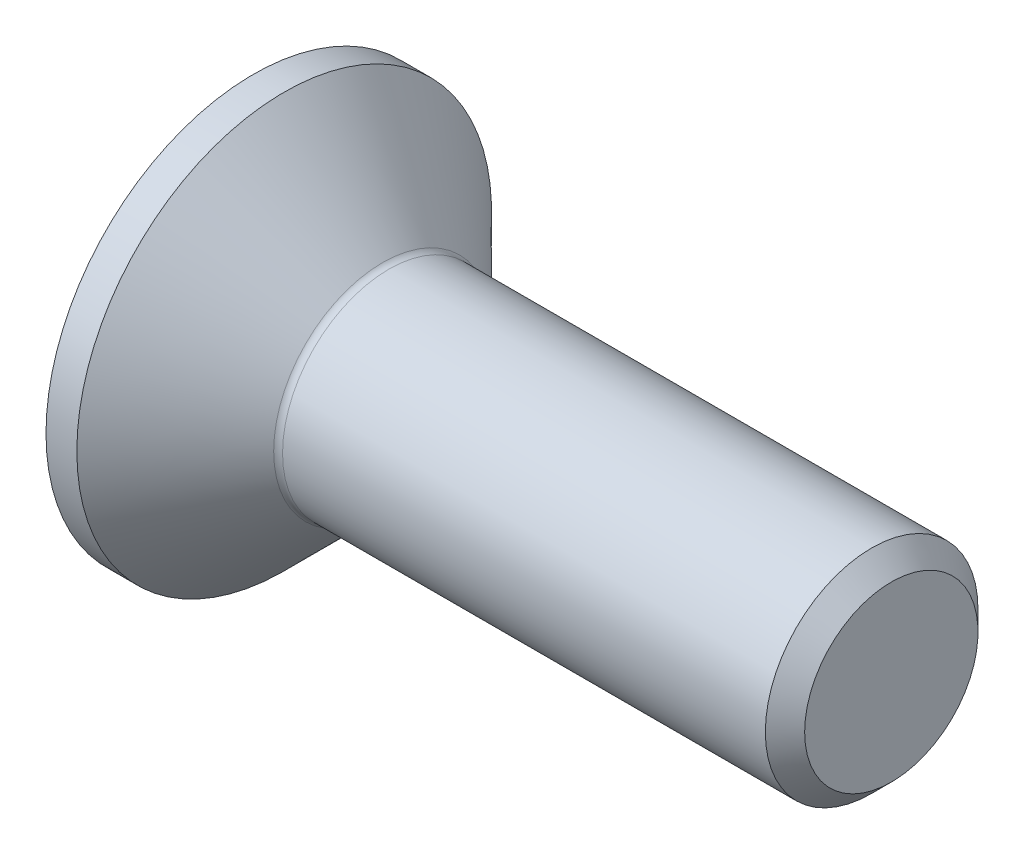
ISO-10303-21;
HEADER;
FILE_DESCRIPTION(('STEP AP214'),'2;1');
FILE_NAME('part.step','',(''),(''),'','','');
FILE_SCHEMA(('AUTOMOTIVE_DESIGN { 1 0 10303 214 1 1 1 1 }'));
ENDSEC;
DATA;
#1=APPLICATION_CONTEXT('core data for automotive mechanical design processes');
#2=APPLICATION_PROTOCOL_DEFINITION('international standard','automotive_design',2000,#1);
#3=PRODUCT_CONTEXT('',#1,'mechanical');
#4=PRODUCT('Part','Part','',(#3));
#5=PRODUCT_RELATED_PRODUCT_CATEGORY('part','',(#4));
#6=PRODUCT_DEFINITION_FORMATION('','',#4);
#7=PRODUCT_DEFINITION_CONTEXT('part definition',#1,'design');
#8=PRODUCT_DEFINITION('design','',#6,#7);
#9=PRODUCT_DEFINITION_SHAPE('','',#8);
#10=(LENGTH_UNIT() NAMED_UNIT(*) SI_UNIT(.MILLI.,.METRE.));
#11=(NAMED_UNIT(*) PLANE_ANGLE_UNIT() SI_UNIT($,.RADIAN.));
#12=(NAMED_UNIT(*) SI_UNIT($,.STERADIAN.) SOLID_ANGLE_UNIT());
#13=UNCERTAINTY_MEASURE_WITH_UNIT(LENGTH_MEASURE(1.E-05),#10,'distance_accuracy_value','');
#14=(GEOMETRIC_REPRESENTATION_CONTEXT(3) GLOBAL_UNCERTAINTY_ASSIGNED_CONTEXT((#13)) GLOBAL_UNIT_ASSIGNED_CONTEXT((#10,
#11,#12)) REPRESENTATION_CONTEXT('',''));
#15=CARTESIAN_POINT('',(0.,0.,0.));
#16=DIRECTION('',(0.,0.,1.));
#17=DIRECTION('',(1.,0.,0.));
#18=AXIS2_PLACEMENT_3D('',#15,#16,#17);
#19=CARTESIAN_POINT('',(0.,0.,0.));
#20=DIRECTION('',(-1.,0.,0.));
#21=DIRECTION('',(0.,0.,1.));
#22=AXIS2_PLACEMENT_3D('',#19,#20,#21);
#23=PLANE('',#22);
#24=CARTESIAN_POINT('',(0.,0.,0.));
#25=DIRECTION('',(-1.,0.,0.));
#26=DIRECTION('',(0.,0.,1.));
#27=AXIS2_PLACEMENT_3D('',#24,#25,#26);
#28=CIRCLE('',#27,5.85);
#29=CARTESIAN_POINT('',(0.,0.,5.85));
#30=VERTEX_POINT('',#29);
#31=EDGE_CURVE('E158',#30,#30,#28,.T.);
#32=ORIENTED_EDGE('',*,*,#31,.T.);
#33=EDGE_LOOP('',(#32));
#34=FACE_BOUND('',#33,.T.);
#35=DIRECTION('',(0.,-0.500000000000001,-0.866025403784438));
#36=VECTOR('',#35,1.);
#37=CARTESIAN_POINT('',(0.,-1.15470053837925,2.));
#38=LINE('',#37,#36);
#39=CARTESIAN_POINT('',(0.,-1.15470053837925,2.));
#40=VERTEX_POINT('',#39);
#41=CARTESIAN_POINT('',(0.,-2.3094010767585,0.));
#42=VERTEX_POINT('',#41);
#43=EDGE_CURVE('E120',#40,#42,#38,.T.);
#44=ORIENTED_EDGE('',*,*,#43,.T.);
#45=DIRECTION('',(0.,0.500000000000001,-0.866025403784438));
#46=VECTOR('',#45,1.);
#47=CARTESIAN_POINT('',(0.,-2.3094010767585,0.));
#48=LINE('',#47,#46);
#49=CARTESIAN_POINT('',(0.,-1.15470053837925,-2.));
#50=VERTEX_POINT('',#49);
#51=EDGE_CURVE('E50',#42,#50,#48,.T.);
#52=ORIENTED_EDGE('',*,*,#51,.T.);
#53=DIRECTION('',(0.,1.,0.));
#54=VECTOR('',#53,1.);
#55=CARTESIAN_POINT('',(0.,-1.15470053837925,-2.));
#56=LINE('',#55,#54);
#57=CARTESIAN_POINT('',(0.,1.15470053837925,-2.));
#58=VERTEX_POINT('',#57);
#59=EDGE_CURVE('E135',#50,#58,#56,.T.);
#60=ORIENTED_EDGE('',*,*,#59,.T.);
#61=DIRECTION('',(0.,0.5,0.866025403784438));
#62=VECTOR('',#61,1.);
#63=CARTESIAN_POINT('',(0.,1.15470053837925,-2.));
#64=LINE('',#63,#62);
#65=CARTESIAN_POINT('',(0.,2.3094010767585,0.));
#66=VERTEX_POINT('',#65);
#67=EDGE_CURVE('E271',#58,#66,#64,.T.);
#68=ORIENTED_EDGE('',*,*,#67,.T.);
#69=DIRECTION('',(0.,-0.5,0.866025403784439));
#70=VECTOR('',#69,1.);
#71=CARTESIAN_POINT('',(0.,2.3094010767585,0.));
#72=LINE('',#71,#70);
#73=CARTESIAN_POINT('',(0.,1.15470053837925,2.));
#74=VERTEX_POINT('',#73);
#75=EDGE_CURVE('E274',#66,#74,#72,.T.);
#76=ORIENTED_EDGE('',*,*,#75,.T.);
#77=DIRECTION('',(0.,-1.,0.));
#78=VECTOR('',#77,1.);
#79=CARTESIAN_POINT('',(0.,1.15470053837925,2.));
#80=LINE('',#79,#78);
#81=EDGE_CURVE('E277',#74,#40,#80,.T.);
#82=ORIENTED_EDGE('',*,*,#81,.T.);
#83=EDGE_LOOP('',(#44,#52,#60,#68,#76,#82));
#84=FACE_BOUND('',#83,.T.);
#85=ADVANCED_FACE('F35',(#34,#84),#23,.T.);
#86=CARTESIAN_POINT('',(0.,0.,0.));
#87=DIRECTION('',(-1.,0.,0.));
#88=DIRECTION('',(0.,0.,1.));
#89=AXIS2_PLACEMENT_3D('',#86,#87,#88);
#90=CYLINDRICAL_SURFACE('',#89,5.85);
#91=CARTESIAN_POINT('',(0.870000000000014,0.,0.));
#92=DIRECTION('',(-1.,0.,0.));
#93=DIRECTION('',(0.,0.,1.));
#94=AXIS2_PLACEMENT_3D('',#91,#92,#93);
#95=CIRCLE('',#94,5.85);
#96=CARTESIAN_POINT('',(0.870000000000014,0.,5.85));
#97=VERTEX_POINT('',#96);
#98=EDGE_CURVE('E155',#97,#97,#95,.T.);
#99=ORIENTED_EDGE('',*,*,#98,.T.);
#100=EDGE_LOOP('',(#99));
#101=FACE_BOUND('',#100,.T.);
#102=ORIENTED_EDGE('',*,*,#31,.F.);
#103=EDGE_LOOP('',(#102));
#104=FACE_BOUND('',#103,.T.);
#105=ADVANCED_FACE('F179',(#101,#104),#90,.T.);
#106=CARTESIAN_POINT('',(0.870000000000014,0.,0.));
#107=DIRECTION('',(-1.,0.,0.));
#108=DIRECTION('',(0.,0.,1.));
#109=AXIS2_PLACEMENT_3D('',#106,#107,#108);
#110=CONICAL_SURFACE('',#109,5.85,0.78539816339745);
#111=CARTESIAN_POINT('',(3.64677669529668,0.,0.));
#112=DIRECTION('',(-1.,0.,0.));
#113=DIRECTION('',(0.,0.,1.));
#114=AXIS2_PLACEMENT_3D('',#111,#112,#113);
#115=CIRCLE('',#114,3.07322330470332);
#116=CARTESIAN_POINT('',(3.64677669529668,0.,3.07322330470332));
#117=VERTEX_POINT('',#116);
#118=EDGE_CURVE('E43',#117,#117,#115,.T.);
#119=ORIENTED_EDGE('',*,*,#118,.T.);
#120=EDGE_LOOP('',(#119));
#121=FACE_BOUND('',#120,.T.);
#122=ORIENTED_EDGE('',*,*,#98,.F.);
#123=EDGE_LOOP('',(#122));
#124=FACE_BOUND('',#123,.T.);
#125=ADVANCED_FACE('F163',(#121,#124),#110,.T.);
#126=CARTESIAN_POINT('',(0.,0.,0.));
#127=DIRECTION('',(-1.,0.,0.));
#128=DIRECTION('',(0.,0.,1.));
#129=AXIS2_PLACEMENT_3D('',#126,#127,#128);
#130=CYLINDRICAL_SURFACE('',#129,2.99999999999996);
#131=CARTESIAN_POINT('',(3.82355339059332,0.,0.));
#132=DIRECTION('',(-1.,0.,0.));
#133=DIRECTION('',(0.,0.,1.));
#134=AXIS2_PLACEMENT_3D('',#131,#132,#133);
#135=CIRCLE('',#134,2.99999999999996);
#136=CARTESIAN_POINT('',(3.82355339059332,0.,2.99999999999996));
#137=VERTEX_POINT('',#136);
#138=EDGE_CURVE('E11',#137,#137,#135,.F.);
#139=ORIENTED_EDGE('',*,*,#138,.T.);
#140=EDGE_LOOP('',(#139));
#141=FACE_BOUND('',#140,.T.);
#142=CARTESIAN_POINT('',(17.4454999999999,0.,0.));
#143=DIRECTION('',(-1.,0.,0.));
#144=DIRECTION('',(0.,0.,1.));
#145=AXIS2_PLACEMENT_3D('',#142,#143,#144);
#146=CIRCLE('',#145,2.99999999999992);
#147=CARTESIAN_POINT('',(17.4454999999999,0.,2.99999999999992));
#148=VERTEX_POINT('',#147);
#149=EDGE_CURVE('E152',#148,#148,#146,.T.);
#150=ORIENTED_EDGE('',*,*,#149,.T.);
#151=EDGE_LOOP('',(#150));
#152=FACE_BOUND('',#151,.T.);
#153=ADVANCED_FACE('F190',(#141,#152),#130,.T.);
#154=CARTESIAN_POINT('',(18.,0.,0.));
#155=DIRECTION('',(-1.,0.,0.));
#156=DIRECTION('',(0.,0.,1.));
#157=AXIS2_PLACEMENT_3D('',#154,#155,#156);
#158=CONICAL_SURFACE('',#157,2.4455,0.785398163397309);
#159=ORIENTED_EDGE('',*,*,#149,.F.);
#160=EDGE_LOOP('',(#159));
#161=FACE_BOUND('',#160,.T.);
#162=CARTESIAN_POINT('',(18.,0.,0.));
#163=DIRECTION('',(-1.,0.,0.));
#164=DIRECTION('',(0.,0.,1.));
#165=AXIS2_PLACEMENT_3D('',#162,#163,#164);
#166=CIRCLE('',#165,2.4455);
#167=CARTESIAN_POINT('',(18.,0.,2.4455));
#168=VERTEX_POINT('',#167);
#169=EDGE_CURVE('E148',#168,#168,#166,.T.);
#170=ORIENTED_EDGE('',*,*,#169,.T.);
#171=EDGE_LOOP('',(#170));
#172=FACE_BOUND('',#171,.T.);
#173=ADVANCED_FACE('F174',(#161,#172),#158,.T.);
#174=CARTESIAN_POINT('',(18.,2.4455,0.));
#175=DIRECTION('',(1.,0.,0.));
#176=DIRECTION('',(0.,0.,-1.));
#177=AXIS2_PLACEMENT_3D('',#174,#175,#176);
#178=PLANE('',#177);
#179=ORIENTED_EDGE('',*,*,#169,.F.);
#180=EDGE_LOOP('',(#179));
#181=FACE_BOUND('',#180,.T.);
#182=ADVANCED_FACE('F167',(#181),#178,.T.);
#183=CARTESIAN_POINT('',(3.82355339059332,0.,0.));
#184=DIRECTION('',(-1.,0.,0.));
#185=DIRECTION('',(0.,0.,1.));
#186=AXIS2_PLACEMENT_3D('',#183,#184,#185);
#187=TOROIDAL_SURFACE('',#186,3.24999999999996,0.25);
#188=ORIENTED_EDGE('',*,*,#138,.F.);
#189=EDGE_LOOP('',(#188));
#190=FACE_BOUND('',#189,.T.);
#191=ORIENTED_EDGE('',*,*,#118,.F.);
#192=EDGE_LOOP('',(#191));
#193=FACE_BOUND('',#192,.T.);
#194=ADVANCED_FACE('F37',(#190,#193),#187,.F.);
#195=CARTESIAN_POINT('',(2.2,-2.3094010767585,0.));
#196=DIRECTION('',(0.,0.866025403784438,0.500000000000001));
#197=DIRECTION('',(0.,-0.500000000000001,0.866025403784438));
#198=AXIS2_PLACEMENT_3D('',#195,#196,#197);
#199=PLANE('',#198);
#200=ORIENTED_EDGE('',*,*,#51,.F.);
#201=DIRECTION('',(-1.,0.,0.));
#202=VECTOR('',#201,1.);
#203=CARTESIAN_POINT('',(2.2,-2.3094010767585,0.));
#204=LINE('',#203,#202);
#205=CARTESIAN_POINT('',(2.2,-2.3094010767585,0.));
#206=VERTEX_POINT('',#205);
#207=EDGE_CURVE('E268',#206,#42,#204,.T.);
#208=ORIENTED_EDGE('',*,*,#207,.F.);
#209=DIRECTION('',(0.,0.500000000000001,-0.866025403784438));
#210=VECTOR('',#209,1.);
#211=CARTESIAN_POINT('',(2.2,-2.3094010767585,0.));
#212=LINE('',#211,#210);
#213=CARTESIAN_POINT('',(2.2,-1.73205080756888,-1.));
#214=VERTEX_POINT('',#213);
#215=EDGE_CURVE('E117',#206,#214,#212,.T.);
#216=ORIENTED_EDGE('',*,*,#215,.T.);
#217=CARTESIAN_POINT('',(2.2,-1.15470053837925,-2.));
#218=VERTEX_POINT('',#217);
#219=EDGE_CURVE('E111',#214,#218,#212,.T.);
#220=ORIENTED_EDGE('',*,*,#219,.T.);
#221=DIRECTION('',(-1.,0.,0.));
#222=VECTOR('',#221,1.);
#223=CARTESIAN_POINT('',(2.2,-1.15470053837925,-2.));
#224=LINE('',#223,#222);
#225=EDGE_CURVE('E115',#218,#50,#224,.T.);
#226=ORIENTED_EDGE('',*,*,#225,.T.);
#227=EDGE_LOOP('',(#200,#208,#216,#220,#226));
#228=FACE_BOUND('',#227,.T.);
#229=ADVANCED_FACE('F113',(#228),#199,.T.);
#230=CARTESIAN_POINT('',(2.2,-1.15470053837925,-2.));
#231=DIRECTION('',(0.,0.,1.));
#232=DIRECTION('',(1.,0.,0.));
#233=AXIS2_PLACEMENT_3D('',#230,#231,#232);
#234=PLANE('',#233);
#235=ORIENTED_EDGE('',*,*,#59,.F.);
#236=ORIENTED_EDGE('',*,*,#225,.F.);
#237=DIRECTION('',(0.,1.,0.));
#238=VECTOR('',#237,1.);
#239=CARTESIAN_POINT('',(2.2,-1.15470053837925,-2.));
#240=LINE('',#239,#238);
#241=CARTESIAN_POINT('',(2.2,0.,-2.));
#242=VERTEX_POINT('',#241);
#243=EDGE_CURVE('E123',#218,#242,#240,.T.);
#244=ORIENTED_EDGE('',*,*,#243,.T.);
#245=CARTESIAN_POINT('',(2.2,1.15470053837925,-2.));
#246=VERTEX_POINT('',#245);
#247=EDGE_CURVE('E130',#242,#246,#240,.T.);
#248=ORIENTED_EDGE('',*,*,#247,.T.);
#249=DIRECTION('',(-1.,0.,0.));
#250=VECTOR('',#249,1.);
#251=CARTESIAN_POINT('',(2.2,1.15470053837925,-2.));
#252=LINE('',#251,#250);
#253=EDGE_CURVE('E137',#246,#58,#252,.T.);
#254=ORIENTED_EDGE('',*,*,#253,.T.);
#255=EDGE_LOOP('',(#235,#236,#244,#248,#254));
#256=FACE_BOUND('',#255,.T.);
#257=ADVANCED_FACE('F132',(#256),#234,.T.);
#258=CARTESIAN_POINT('',(2.2,1.15470053837925,-2.));
#259=DIRECTION('',(0.,-0.866025403784439,0.5));
#260=DIRECTION('',(0.,-0.5,-0.866025403784439));
#261=AXIS2_PLACEMENT_3D('',#258,#259,#260);
#262=PLANE('',#261);
#263=ORIENTED_EDGE('',*,*,#67,.F.);
#264=ORIENTED_EDGE('',*,*,#253,.F.);
#265=DIRECTION('',(0.,0.5,0.866025403784438));
#266=VECTOR('',#265,1.);
#267=CARTESIAN_POINT('',(2.2,1.15470053837925,-2.));
#268=LINE('',#267,#266);
#269=CARTESIAN_POINT('',(2.2,1.73205080756888,-1.));
#270=VERTEX_POINT('',#269);
#271=EDGE_CURVE('E260',#246,#270,#268,.T.);
#272=ORIENTED_EDGE('',*,*,#271,.T.);
#273=CARTESIAN_POINT('',(2.2,2.3094010767585,0.));
#274=VERTEX_POINT('',#273);
#275=EDGE_CURVE('E129',#270,#274,#268,.T.);
#276=ORIENTED_EDGE('',*,*,#275,.T.);
#277=DIRECTION('',(-1.,0.,0.));
#278=VECTOR('',#277,1.);
#279=CARTESIAN_POINT('',(2.2,2.3094010767585,0.));
#280=LINE('',#279,#278);
#281=EDGE_CURVE('E143',#274,#66,#280,.T.);
#282=ORIENTED_EDGE('',*,*,#281,.T.);
#283=EDGE_LOOP('',(#263,#264,#272,#276,#282));
#284=FACE_BOUND('',#283,.T.);
#285=ADVANCED_FACE('F204',(#284),#262,.T.);
#286=CARTESIAN_POINT('',(2.2,2.3094010767585,0.));
#287=DIRECTION('',(0.,-0.866025403784439,-0.5));
#288=DIRECTION('',(0.,0.5,-0.866025403784439));
#289=AXIS2_PLACEMENT_3D('',#286,#287,#288);
#290=PLANE('',#289);
#291=ORIENTED_EDGE('',*,*,#75,.F.);
#292=ORIENTED_EDGE('',*,*,#281,.F.);
#293=DIRECTION('',(0.,-0.5,0.866025403784439));
#294=VECTOR('',#293,1.);
#295=CARTESIAN_POINT('',(2.2,2.3094010767585,0.));
#296=LINE('',#295,#294);
#297=CARTESIAN_POINT('',(2.2,1.73205080756888,1.));
#298=VERTEX_POINT('',#297);
#299=EDGE_CURVE('E58',#274,#298,#296,.T.);
#300=ORIENTED_EDGE('',*,*,#299,.T.);
#301=CARTESIAN_POINT('',(2.2,1.15470053837925,2.));
#302=VERTEX_POINT('',#301);
#303=EDGE_CURVE('E239',#298,#302,#296,.T.);
#304=ORIENTED_EDGE('',*,*,#303,.T.);
#305=DIRECTION('',(-1.,0.,0.));
#306=VECTOR('',#305,1.);
#307=CARTESIAN_POINT('',(2.2,1.15470053837925,2.));
#308=LINE('',#307,#306);
#309=EDGE_CURVE('E253',#302,#74,#308,.T.);
#310=ORIENTED_EDGE('',*,*,#309,.T.);
#311=EDGE_LOOP('',(#291,#292,#300,#304,#310));
#312=FACE_BOUND('',#311,.T.);
#313=ADVANCED_FACE('F207',(#312),#290,.T.);
#314=CARTESIAN_POINT('',(2.2,1.15470053837925,2.));
#315=DIRECTION('',(0.,0.,-1.));
#316=DIRECTION('',(-1.,0.,0.));
#317=AXIS2_PLACEMENT_3D('',#314,#315,#316);
#318=PLANE('',#317);
#319=ORIENTED_EDGE('',*,*,#81,.F.);
#320=ORIENTED_EDGE('',*,*,#309,.F.);
#321=DIRECTION('',(0.,-1.,0.));
#322=VECTOR('',#321,1.);
#323=CARTESIAN_POINT('',(2.2,1.15470053837925,2.));
#324=LINE('',#323,#322);
#325=CARTESIAN_POINT('',(2.2,0.,2.));
#326=VERTEX_POINT('',#325);
#327=EDGE_CURVE('E238',#302,#326,#324,.T.);
#328=ORIENTED_EDGE('',*,*,#327,.T.);
#329=CARTESIAN_POINT('',(2.2,-1.15470053837925,2.));
#330=VERTEX_POINT('',#329);
#331=EDGE_CURVE('E244',#326,#330,#324,.T.);
#332=ORIENTED_EDGE('',*,*,#331,.T.);
#333=DIRECTION('',(-1.,0.,0.));
#334=VECTOR('',#333,1.);
#335=CARTESIAN_POINT('',(2.2,-1.15470053837925,2.));
#336=LINE('',#335,#334);
#337=EDGE_CURVE('E283',#330,#40,#336,.T.);
#338=ORIENTED_EDGE('',*,*,#337,.T.);
#339=EDGE_LOOP('',(#319,#320,#328,#332,#338));
#340=FACE_BOUND('',#339,.T.);
#341=ADVANCED_FACE('F211',(#340),#318,.T.);
#342=CARTESIAN_POINT('',(2.2,-1.15470053837925,2.));
#343=DIRECTION('',(0.,0.866025403784438,-0.500000000000001));
#344=DIRECTION('',(0.,0.500000000000002,0.866025403784438));
#345=AXIS2_PLACEMENT_3D('',#342,#343,#344);
#346=PLANE('',#345);
#347=ORIENTED_EDGE('',*,*,#43,.F.);
#348=ORIENTED_EDGE('',*,*,#337,.F.);
#349=DIRECTION('',(0.,-0.500000000000001,-0.866025403784438));
#350=VECTOR('',#349,1.);
#351=CARTESIAN_POINT('',(2.2,-1.15470053837925,2.));
#352=LINE('',#351,#350);
#353=CARTESIAN_POINT('',(2.2,-1.73205080756888,1.));
#354=VERTEX_POINT('',#353);
#355=EDGE_CURVE('E247',#330,#354,#352,.T.);
#356=ORIENTED_EDGE('',*,*,#355,.T.);
#357=EDGE_CURVE('E254',#354,#206,#352,.T.);
#358=ORIENTED_EDGE('',*,*,#357,.T.);
#359=ORIENTED_EDGE('',*,*,#207,.T.);
#360=EDGE_LOOP('',(#347,#348,#356,#358,#359));
#361=FACE_BOUND('',#360,.T.);
#362=ADVANCED_FACE('F214',(#361),#346,.T.);
#363=CARTESIAN_POINT('',(2.2,-2.3094010767585,0.));
#364=DIRECTION('',(-1.,0.,0.));
#365=DIRECTION('',(0.,0.,1.));
#366=AXIS2_PLACEMENT_3D('',#363,#364,#365);
#367=PLANE('',#366);
#368=CARTESIAN_POINT('',(2.2,0.,0.));
#369=DIRECTION('',(-1.,0.,0.));
#370=DIRECTION('',(0.,0.,1.));
#371=AXIS2_PLACEMENT_3D('',#368,#369,#370);
#372=CIRCLE('',#371,2.);
#373=EDGE_CURVE('E136',#354,#326,#372,.T.);
#374=ORIENTED_EDGE('',*,*,#373,.F.);
#375=ORIENTED_EDGE('',*,*,#355,.F.);
#376=ORIENTED_EDGE('',*,*,#331,.F.);
#377=EDGE_LOOP('',(#374,#375,#376));
#378=FACE_BOUND('',#377,.T.);
#379=ADVANCED_FACE('F218',(#378),#367,.T.);
#380=EDGE_CURVE('E140',#214,#354,#372,.T.);
#381=ORIENTED_EDGE('',*,*,#380,.F.);
#382=ORIENTED_EDGE('',*,*,#215,.F.);
#383=ORIENTED_EDGE('',*,*,#357,.F.);
#384=EDGE_LOOP('',(#381,#382,#383));
#385=FACE_BOUND('',#384,.T.);
#386=ADVANCED_FACE('F221',(#385),#367,.T.);
#387=EDGE_CURVE('E125',#242,#214,#372,.T.);
#388=ORIENTED_EDGE('',*,*,#387,.F.);
#389=ORIENTED_EDGE('',*,*,#243,.F.);
#390=ORIENTED_EDGE('',*,*,#219,.F.);
#391=EDGE_LOOP('',(#388,#389,#390));
#392=FACE_BOUND('',#391,.T.);
#393=ADVANCED_FACE('F124',(#392),#367,.T.);
#394=EDGE_CURVE('E256',#270,#242,#372,.T.);
#395=ORIENTED_EDGE('',*,*,#394,.F.);
#396=ORIENTED_EDGE('',*,*,#271,.F.);
#397=ORIENTED_EDGE('',*,*,#247,.F.);
#398=EDGE_LOOP('',(#395,#396,#397));
#399=FACE_BOUND('',#398,.T.);
#400=ADVANCED_FACE('F233',(#399),#367,.T.);
#401=EDGE_CURVE('E149',#298,#270,#372,.T.);
#402=ORIENTED_EDGE('',*,*,#401,.F.);
#403=ORIENTED_EDGE('',*,*,#299,.F.);
#404=ORIENTED_EDGE('',*,*,#275,.F.);
#405=EDGE_LOOP('',(#402,#403,#404));
#406=FACE_BOUND('',#405,.T.);
#407=ADVANCED_FACE('F228',(#406),#367,.T.);
#408=EDGE_CURVE('E142',#326,#298,#372,.T.);
#409=ORIENTED_EDGE('',*,*,#408,.F.);
#410=ORIENTED_EDGE('',*,*,#327,.F.);
#411=ORIENTED_EDGE('',*,*,#303,.F.);
#412=EDGE_LOOP('',(#409,#410,#411));
#413=FACE_BOUND('',#412,.T.);
#414=ADVANCED_FACE('F199',(#413),#367,.T.);
#415=CARTESIAN_POINT('',(2.2,0.,0.));
#416=DIRECTION('',(-1.,0.,0.));
#417=DIRECTION('',(0.,0.,1.));
#418=AXIS2_PLACEMENT_3D('',#415,#416,#417);
#419=CONICAL_SURFACE('',#418,2.,1.04719755119659);
#420=CARTESIAN_POINT('',(3.35470053837926,0.,0.));
#421=VERTEX_POINT('',#420);
#422=VERTEX_LOOP('',#421);
#423=FACE_BOUND('',#422,.T.);
#424=ORIENTED_EDGE('',*,*,#408,.T.);
#425=ORIENTED_EDGE('',*,*,#401,.T.);
#426=ORIENTED_EDGE('',*,*,#394,.T.);
#427=ORIENTED_EDGE('',*,*,#387,.T.);
#428=ORIENTED_EDGE('',*,*,#380,.T.);
#429=ORIENTED_EDGE('',*,*,#373,.T.);
#430=EDGE_LOOP('',(#424,#425,#426,#427,#428,#429));
#431=FACE_BOUND('',#430,.T.);
#432=ADVANCED_FACE('F197',(#423,#431),#419,.F.);
#433=CLOSED_SHELL('',(#85,#105,#125,#153,#173,#182,#194,#229,#257,#285,#313,#341,#362,#379,#386,
#393,#400,#407,#414,#432));
#434=MANIFOLD_SOLID_BREP('B2',#433);
#435=ADVANCED_BREP_SHAPE_REPRESENTATION('',(#18,#434),#14);
#436=SHAPE_DEFINITION_REPRESENTATION(#9,#435);
ENDSEC;
END-ISO-10303-21;
